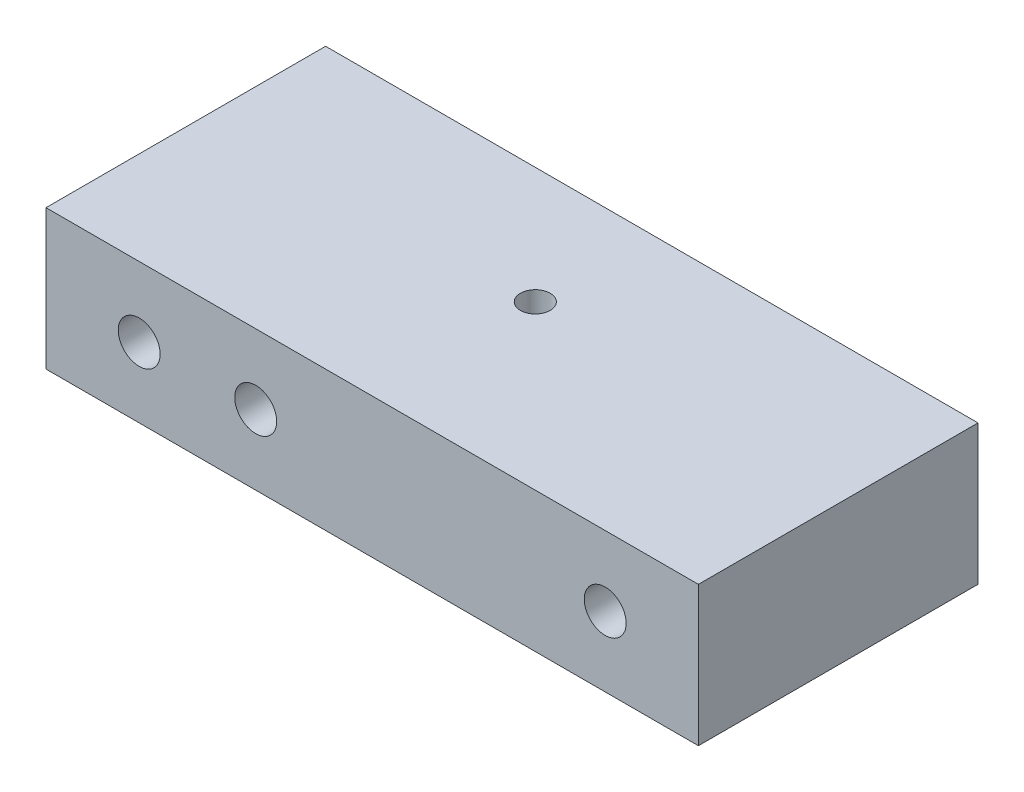
ISO-10303-21;
HEADER;
FILE_DESCRIPTION(('STEP AP214'),'2;1');
FILE_NAME('part.step','',(''),(''),'','','');
FILE_SCHEMA(('AUTOMOTIVE_DESIGN { 1 0 10303 214 1 1 1 1 }'));
ENDSEC;
DATA;
#1=APPLICATION_CONTEXT('core data for automotive mechanical design processes');
#2=APPLICATION_PROTOCOL_DEFINITION('international standard','automotive_design',2000,#1);
#3=PRODUCT_CONTEXT('',#1,'mechanical');
#4=PRODUCT('Part','Part','',(#3));
#5=PRODUCT_RELATED_PRODUCT_CATEGORY('part','',(#4));
#6=PRODUCT_DEFINITION_FORMATION('','',#4);
#7=PRODUCT_DEFINITION_CONTEXT('part definition',#1,'design');
#8=PRODUCT_DEFINITION('design','',#6,#7);
#9=PRODUCT_DEFINITION_SHAPE('','',#8);
#10=(LENGTH_UNIT() NAMED_UNIT(*) SI_UNIT(.MILLI.,.METRE.));
#11=(NAMED_UNIT(*) PLANE_ANGLE_UNIT() SI_UNIT($,.RADIAN.));
#12=(NAMED_UNIT(*) SI_UNIT($,.STERADIAN.) SOLID_ANGLE_UNIT());
#13=UNCERTAINTY_MEASURE_WITH_UNIT(LENGTH_MEASURE(1.E-05),#10,'distance_accuracy_value','');
#14=(GEOMETRIC_REPRESENTATION_CONTEXT(3) GLOBAL_UNCERTAINTY_ASSIGNED_CONTEXT((#13)) GLOBAL_UNIT_ASSIGNED_CONTEXT((#10,
#11,#12)) REPRESENTATION_CONTEXT('',''));
#15=CARTESIAN_POINT('',(0.,0.,0.));
#16=DIRECTION('',(0.,0.,1.));
#17=DIRECTION('',(1.,0.,0.));
#18=AXIS2_PLACEMENT_3D('',#15,#16,#17);
#19=CARTESIAN_POINT('',(70.,30.,-30.));
#20=DIRECTION('',(-1.,0.,0.));
#21=DIRECTION('',(0.,0.,1.));
#22=AXIS2_PLACEMENT_3D('',#19,#20,#21);
#23=PLANE('',#22);
#24=DIRECTION('',(0.,0.,-1.));
#25=VECTOR('',#24,1.);
#26=CARTESIAN_POINT('',(70.,0.,-30.));
#27=LINE('',#26,#25);
#28=CARTESIAN_POINT('',(70.,0.,30.));
#29=VERTEX_POINT('',#28);
#30=CARTESIAN_POINT('',(70.,0.,-30.));
#31=VERTEX_POINT('',#30);
#32=EDGE_CURVE('E107',#29,#31,#27,.T.);
#33=ORIENTED_EDGE('',*,*,#32,.T.);
#34=DIRECTION('',(0.,-1.,0.));
#35=VECTOR('',#34,1.);
#36=CARTESIAN_POINT('',(70.,30.,-30.));
#37=LINE('',#36,#35);
#38=CARTESIAN_POINT('',(70.,30.,-30.));
#39=VERTEX_POINT('',#38);
#40=EDGE_CURVE('E11',#39,#31,#37,.T.);
#41=ORIENTED_EDGE('',*,*,#40,.F.);
#42=DIRECTION('',(0.,0.,-1.));
#43=VECTOR('',#42,1.);
#44=CARTESIAN_POINT('',(70.,30.,-30.));
#45=LINE('',#44,#43);
#46=CARTESIAN_POINT('',(70.,30.,30.));
#47=VERTEX_POINT('',#46);
#48=EDGE_CURVE('E91',#47,#39,#45,.T.);
#49=ORIENTED_EDGE('',*,*,#48,.F.);
#50=DIRECTION('',(0.,-1.,0.));
#51=VECTOR('',#50,1.);
#52=CARTESIAN_POINT('',(70.,30.,30.));
#53=LINE('',#52,#51);
#54=EDGE_CURVE('E103',#47,#29,#53,.T.);
#55=ORIENTED_EDGE('',*,*,#54,.T.);
#56=EDGE_LOOP('',(#33,#41,#49,#55));
#57=FACE_BOUND('',#56,.T.);
#58=ADVANCED_FACE('F39',(#57),#23,.F.);
#59=CARTESIAN_POINT('',(-70.,30.,-30.));
#60=DIRECTION('',(0.,0.,1.));
#61=DIRECTION('',(1.,0.,0.));
#62=AXIS2_PLACEMENT_3D('',#59,#60,#61);
#63=PLANE('',#62);
#64=CARTESIAN_POINT('',(50.,15.,-30.));
#65=DIRECTION('',(0.,0.,1.));
#66=DIRECTION('',(1.,0.,0.));
#67=AXIS2_PLACEMENT_3D('',#64,#65,#66);
#68=CIRCLE('',#67,4.5);
#69=CARTESIAN_POINT('',(54.5,15.,-30.));
#70=VERTEX_POINT('',#69);
#71=EDGE_CURVE('E111',#70,#70,#68,.T.);
#72=ORIENTED_EDGE('',*,*,#71,.T.);
#73=EDGE_LOOP('',(#72));
#74=FACE_BOUND('',#73,.T.);
#75=CARTESIAN_POINT('',(-50.,15.,-30.));
#76=DIRECTION('',(0.,0.,1.));
#77=DIRECTION('',(1.,0.,0.));
#78=AXIS2_PLACEMENT_3D('',#75,#76,#77);
#79=CIRCLE('',#78,4.5);
#80=CARTESIAN_POINT('',(-45.5,15.,-30.));
#81=VERTEX_POINT('',#80);
#82=EDGE_CURVE('E137',#81,#81,#79,.T.);
#83=ORIENTED_EDGE('',*,*,#82,.T.);
#84=EDGE_LOOP('',(#83));
#85=FACE_BOUND('',#84,.T.);
#86=CARTESIAN_POINT('',(-25.,15.,-30.));
#87=DIRECTION('',(0.,0.,1.));
#88=DIRECTION('',(1.,0.,0.));
#89=AXIS2_PLACEMENT_3D('',#86,#87,#88);
#90=CIRCLE('',#89,4.5);
#91=CARTESIAN_POINT('',(-20.5,15.,-30.));
#92=VERTEX_POINT('',#91);
#93=EDGE_CURVE('E128',#92,#92,#90,.T.);
#94=ORIENTED_EDGE('',*,*,#93,.T.);
#95=EDGE_LOOP('',(#94));
#96=FACE_BOUND('',#95,.T.);
#97=DIRECTION('',(-1.,0.,0.));
#98=VECTOR('',#97,1.);
#99=CARTESIAN_POINT('',(-70.,0.,-30.));
#100=LINE('',#99,#98);
#101=CARTESIAN_POINT('',(-70.,0.,-30.));
#102=VERTEX_POINT('',#101);
#103=EDGE_CURVE('E96',#31,#102,#100,.T.);
#104=ORIENTED_EDGE('',*,*,#103,.T.);
#105=DIRECTION('',(0.,-1.,0.));
#106=VECTOR('',#105,1.);
#107=CARTESIAN_POINT('',(-70.,30.,-30.));
#108=LINE('',#107,#106);
#109=CARTESIAN_POINT('',(-70.,30.,-30.));
#110=VERTEX_POINT('',#109);
#111=EDGE_CURVE('E48',#110,#102,#108,.T.);
#112=ORIENTED_EDGE('',*,*,#111,.F.);
#113=DIRECTION('',(-1.,0.,0.));
#114=VECTOR('',#113,1.);
#115=CARTESIAN_POINT('',(-70.,30.,-30.));
#116=LINE('',#115,#114);
#117=EDGE_CURVE('E86',#39,#110,#116,.T.);
#118=ORIENTED_EDGE('',*,*,#117,.F.);
#119=ORIENTED_EDGE('',*,*,#40,.T.);
#120=EDGE_LOOP('',(#104,#112,#118,#119));
#121=FACE_BOUND('',#120,.T.);
#122=ADVANCED_FACE('F95',(#74,#85,#96,#121),#63,.F.);
#123=CARTESIAN_POINT('',(-70.,30.,-30.));
#124=DIRECTION('',(1.,0.,0.));
#125=DIRECTION('',(0.,0.,-1.));
#126=AXIS2_PLACEMENT_3D('',#123,#124,#125);
#127=PLANE('',#126);
#128=DIRECTION('',(0.,0.,1.));
#129=VECTOR('',#128,1.);
#130=CARTESIAN_POINT('',(-70.,0.,-30.));
#131=LINE('',#130,#129);
#132=CARTESIAN_POINT('',(-70.,0.,30.));
#133=VERTEX_POINT('',#132);
#134=EDGE_CURVE('E73',#102,#133,#131,.T.);
#135=ORIENTED_EDGE('',*,*,#134,.T.);
#136=DIRECTION('',(0.,-1.,0.));
#137=VECTOR('',#136,1.);
#138=CARTESIAN_POINT('',(-70.,30.,30.));
#139=LINE('',#138,#137);
#140=CARTESIAN_POINT('',(-70.,30.,30.));
#141=VERTEX_POINT('',#140);
#142=EDGE_CURVE('E98',#141,#133,#139,.T.);
#143=ORIENTED_EDGE('',*,*,#142,.F.);
#144=DIRECTION('',(0.,0.,1.));
#145=VECTOR('',#144,1.);
#146=CARTESIAN_POINT('',(-70.,30.,-30.));
#147=LINE('',#146,#145);
#148=EDGE_CURVE('E89',#110,#141,#147,.T.);
#149=ORIENTED_EDGE('',*,*,#148,.F.);
#150=ORIENTED_EDGE('',*,*,#111,.T.);
#151=EDGE_LOOP('',(#135,#143,#149,#150));
#152=FACE_BOUND('',#151,.T.);
#153=ADVANCED_FACE('F99',(#152),#127,.F.);
#154=CARTESIAN_POINT('',(-70.,30.,30.));
#155=DIRECTION('',(0.,0.,-1.));
#156=DIRECTION('',(-1.,0.,0.));
#157=AXIS2_PLACEMENT_3D('',#154,#155,#156);
#158=PLANE('',#157);
#159=CARTESIAN_POINT('',(50.,15.,30.));
#160=DIRECTION('',(0.,0.,1.));
#161=DIRECTION('',(1.,0.,0.));
#162=AXIS2_PLACEMENT_3D('',#159,#160,#161);
#163=CIRCLE('',#162,4.5);
#164=CARTESIAN_POINT('',(54.5,15.,30.));
#165=VERTEX_POINT('',#164);
#166=EDGE_CURVE('E145',#165,#165,#163,.T.);
#167=ORIENTED_EDGE('',*,*,#166,.F.);
#168=EDGE_LOOP('',(#167));
#169=FACE_BOUND('',#168,.T.);
#170=CARTESIAN_POINT('',(-50.,15.,30.));
#171=DIRECTION('',(0.,0.,1.));
#172=DIRECTION('',(1.,0.,0.));
#173=AXIS2_PLACEMENT_3D('',#170,#171,#172);
#174=CIRCLE('',#173,4.5);
#175=CARTESIAN_POINT('',(-45.5,15.,30.));
#176=VERTEX_POINT('',#175);
#177=EDGE_CURVE('E141',#176,#176,#174,.T.);
#178=ORIENTED_EDGE('',*,*,#177,.F.);
#179=EDGE_LOOP('',(#178));
#180=FACE_BOUND('',#179,.T.);
#181=CARTESIAN_POINT('',(-25.,15.,30.));
#182=DIRECTION('',(0.,0.,1.));
#183=DIRECTION('',(1.,0.,0.));
#184=AXIS2_PLACEMENT_3D('',#181,#182,#183);
#185=CIRCLE('',#184,4.5);
#186=CARTESIAN_POINT('',(-20.5,15.,30.));
#187=VERTEX_POINT('',#186);
#188=EDGE_CURVE('E132',#187,#187,#185,.T.);
#189=ORIENTED_EDGE('',*,*,#188,.F.);
#190=EDGE_LOOP('',(#189));
#191=FACE_BOUND('',#190,.T.);
#192=DIRECTION('',(1.,0.,0.));
#193=VECTOR('',#192,1.);
#194=CARTESIAN_POINT('',(-70.,0.,30.));
#195=LINE('',#194,#193);
#196=EDGE_CURVE('E79',#133,#29,#195,.T.);
#197=ORIENTED_EDGE('',*,*,#196,.T.);
#198=ORIENTED_EDGE('',*,*,#54,.F.);
#199=DIRECTION('',(1.,0.,0.));
#200=VECTOR('',#199,1.);
#201=CARTESIAN_POINT('',(-70.,30.,30.));
#202=LINE('',#201,#200);
#203=EDGE_CURVE('E56',#141,#47,#202,.T.);
#204=ORIENTED_EDGE('',*,*,#203,.F.);
#205=ORIENTED_EDGE('',*,*,#142,.T.);
#206=EDGE_LOOP('',(#197,#198,#204,#205));
#207=FACE_BOUND('',#206,.T.);
#208=ADVANCED_FACE('F121',(#169,#180,#191,#207),#158,.F.);
#209=CARTESIAN_POINT('',(0.,30.,0.));
#210=DIRECTION('',(0.,1.,0.));
#211=DIRECTION('',(0.,0.,1.));
#212=AXIS2_PLACEMENT_3D('',#209,#210,#211);
#213=PLANE('',#212);
#214=CARTESIAN_POINT('',(0.,30.,-5.));
#215=DIRECTION('',(0.,1.,0.));
#216=DIRECTION('',(0.,0.,1.));
#217=AXIS2_PLACEMENT_3D('',#214,#215,#216);
#218=CIRCLE('',#217,3.2);
#219=CARTESIAN_POINT('',(0.,30.,-1.8));
#220=VERTEX_POINT('',#219);
#221=EDGE_CURVE('E152',#220,#220,#218,.T.);
#222=ORIENTED_EDGE('',*,*,#221,.F.);
#223=EDGE_LOOP('',(#222));
#224=FACE_BOUND('',#223,.T.);
#225=ORIENTED_EDGE('',*,*,#48,.T.);
#226=ORIENTED_EDGE('',*,*,#117,.T.);
#227=ORIENTED_EDGE('',*,*,#148,.T.);
#228=ORIENTED_EDGE('',*,*,#203,.T.);
#229=EDGE_LOOP('',(#225,#226,#227,#228));
#230=FACE_BOUND('',#229,.T.);
#231=ADVANCED_FACE('F87',(#224,#230),#213,.T.);
#232=CARTESIAN_POINT('',(0.,0.,0.));
#233=DIRECTION('',(0.,1.,0.));
#234=DIRECTION('',(0.,0.,1.));
#235=AXIS2_PLACEMENT_3D('',#232,#233,#234);
#236=PLANE('',#235);
#237=CARTESIAN_POINT('',(0.,0.,-5.));
#238=DIRECTION('',(0.,1.,0.));
#239=DIRECTION('',(0.,0.,1.));
#240=AXIS2_PLACEMENT_3D('',#237,#238,#239);
#241=CIRCLE('',#240,3.2);
#242=CARTESIAN_POINT('',(0.,0.,-1.8));
#243=VERTEX_POINT('',#242);
#244=EDGE_CURVE('E133',#243,#243,#241,.T.);
#245=ORIENTED_EDGE('',*,*,#244,.T.);
#246=EDGE_LOOP('',(#245));
#247=FACE_BOUND('',#246,.T.);
#248=ORIENTED_EDGE('',*,*,#32,.F.);
#249=ORIENTED_EDGE('',*,*,#196,.F.);
#250=ORIENTED_EDGE('',*,*,#134,.F.);
#251=ORIENTED_EDGE('',*,*,#103,.F.);
#252=EDGE_LOOP('',(#248,#249,#250,#251));
#253=FACE_BOUND('',#252,.T.);
#254=ADVANCED_FACE('F124',(#247,#253),#236,.F.);
#255=CARTESIAN_POINT('',(-25.,15.,-30.));
#256=DIRECTION('',(0.,0.,1.));
#257=DIRECTION('',(1.,0.,0.));
#258=AXIS2_PLACEMENT_3D('',#255,#256,#257);
#259=CYLINDRICAL_SURFACE('',#258,4.5);
#260=ORIENTED_EDGE('',*,*,#93,.F.);
#261=EDGE_LOOP('',(#260));
#262=FACE_BOUND('',#261,.T.);
#263=ORIENTED_EDGE('',*,*,#188,.T.);
#264=EDGE_LOOP('',(#263));
#265=FACE_BOUND('',#264,.T.);
#266=ADVANCED_FACE('F174',(#262,#265),#259,.F.);
#267=CARTESIAN_POINT('',(-50.,15.,-30.));
#268=DIRECTION('',(0.,0.,1.));
#269=DIRECTION('',(1.,0.,0.));
#270=AXIS2_PLACEMENT_3D('',#267,#268,#269);
#271=CYLINDRICAL_SURFACE('',#270,4.5);
#272=ORIENTED_EDGE('',*,*,#82,.F.);
#273=EDGE_LOOP('',(#272));
#274=FACE_BOUND('',#273,.T.);
#275=ORIENTED_EDGE('',*,*,#177,.T.);
#276=EDGE_LOOP('',(#275));
#277=FACE_BOUND('',#276,.T.);
#278=ADVANCED_FACE('F196',(#274,#277),#271,.F.);
#279=CARTESIAN_POINT('',(50.,15.,-30.));
#280=DIRECTION('',(0.,0.,1.));
#281=DIRECTION('',(1.,0.,0.));
#282=AXIS2_PLACEMENT_3D('',#279,#280,#281);
#283=CYLINDRICAL_SURFACE('',#282,4.5);
#284=ORIENTED_EDGE('',*,*,#71,.F.);
#285=EDGE_LOOP('',(#284));
#286=FACE_BOUND('',#285,.T.);
#287=ORIENTED_EDGE('',*,*,#166,.T.);
#288=EDGE_LOOP('',(#287));
#289=FACE_BOUND('',#288,.T.);
#290=ADVANCED_FACE('F164',(#286,#289),#283,.F.);
#291=CARTESIAN_POINT('',(0.,0.,-5.));
#292=DIRECTION('',(0.,1.,0.));
#293=DIRECTION('',(0.,0.,1.));
#294=AXIS2_PLACEMENT_3D('',#291,#292,#293);
#295=CYLINDRICAL_SURFACE('',#294,3.2);
#296=ORIENTED_EDGE('',*,*,#244,.F.);
#297=EDGE_LOOP('',(#296));
#298=FACE_BOUND('',#297,.T.);
#299=ORIENTED_EDGE('',*,*,#221,.T.);
#300=EDGE_LOOP('',(#299));
#301=FACE_BOUND('',#300,.T.);
#302=ADVANCED_FACE('F161',(#298,#301),#295,.F.);
#303=CLOSED_SHELL('',(#58,#122,#153,#208,#231,#254,#266,#278,#290,#302));
#304=MANIFOLD_SOLID_BREP('B2',#303);
#305=ADVANCED_BREP_SHAPE_REPRESENTATION('',(#18,#304),#14);
#306=SHAPE_DEFINITION_REPRESENTATION(#9,#305);
ENDSEC;
END-ISO-10303-21;
